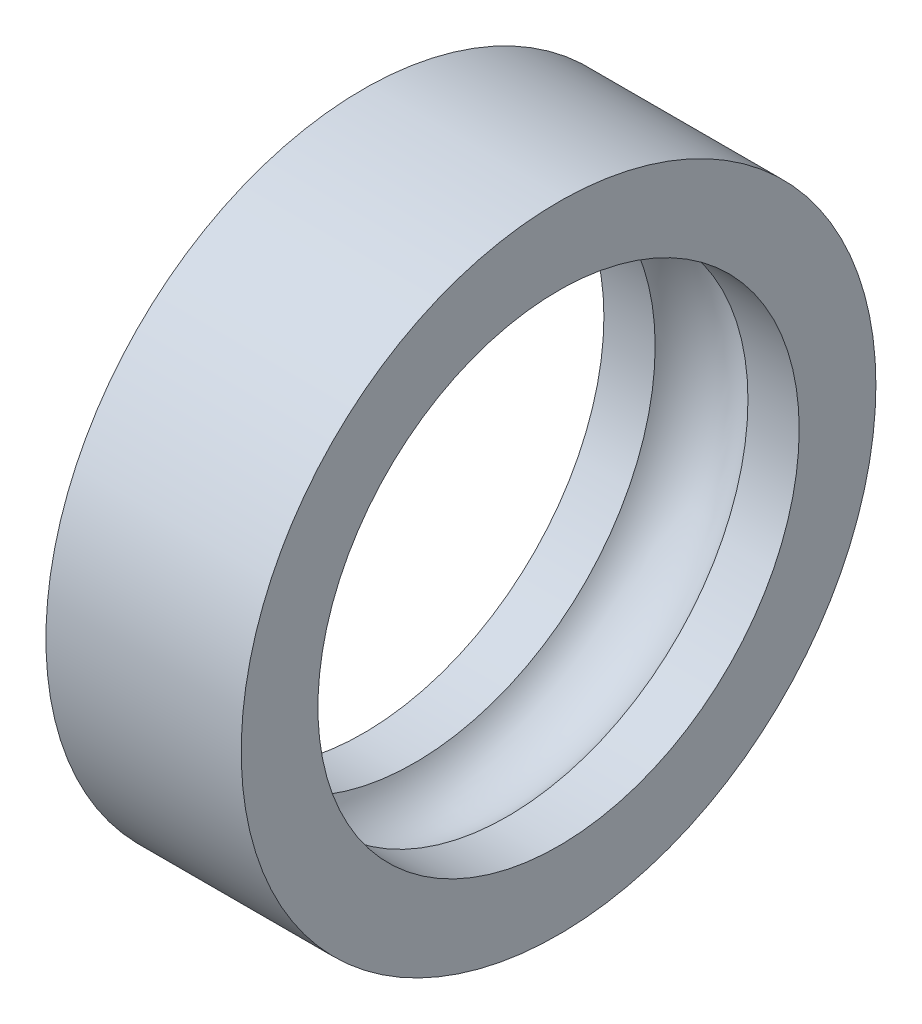
ISO-10303-21;
HEADER;
FILE_DESCRIPTION(('STEP AP214'),'2;1');
FILE_NAME('part.step','',(''),(''),'','','');
FILE_SCHEMA(('AUTOMOTIVE_DESIGN { 1 0 10303 214 1 1 1 1 }'));
ENDSEC;
DATA;
#1=APPLICATION_CONTEXT('core data for automotive mechanical design processes');
#2=APPLICATION_PROTOCOL_DEFINITION('international standard','automotive_design',2000,#1);
#3=PRODUCT_CONTEXT('',#1,'mechanical');
#4=PRODUCT('Part','Part','',(#3));
#5=PRODUCT_RELATED_PRODUCT_CATEGORY('part','',(#4));
#6=PRODUCT_DEFINITION_FORMATION('','',#4);
#7=PRODUCT_DEFINITION_CONTEXT('part definition',#1,'design');
#8=PRODUCT_DEFINITION('design','',#6,#7);
#9=PRODUCT_DEFINITION_SHAPE('','',#8);
#10=(LENGTH_UNIT() NAMED_UNIT(*) SI_UNIT(.MILLI.,.METRE.));
#11=(NAMED_UNIT(*) PLANE_ANGLE_UNIT() SI_UNIT($,.RADIAN.));
#12=(NAMED_UNIT(*) SI_UNIT($,.STERADIAN.) SOLID_ANGLE_UNIT());
#13=UNCERTAINTY_MEASURE_WITH_UNIT(LENGTH_MEASURE(1.E-05),#10,'distance_accuracy_value','');
#14=(GEOMETRIC_REPRESENTATION_CONTEXT(3) GLOBAL_UNCERTAINTY_ASSIGNED_CONTEXT((#13)) GLOBAL_UNIT_ASSIGNED_CONTEXT((#10,
#11,#12)) REPRESENTATION_CONTEXT('',''));
#15=CARTESIAN_POINT('',(0.,0.,0.));
#16=DIRECTION('',(0.,0.,1.));
#17=DIRECTION('',(1.,0.,0.));
#18=AXIS2_PLACEMENT_3D('',#15,#16,#17);
#19=CARTESIAN_POINT('',(-79.7731733916,250.5128135227,0.));
#20=DIRECTION('',(-1.,0.,0.));
#21=DIRECTION('',(0.,0.,1.));
#22=AXIS2_PLACEMENT_3D('',#19,#20,#21);
#23=PLANE('',#22);
#24=CARTESIAN_POINT('',(-79.7731733916,-8.75,0.));
#25=DIRECTION('',(1.,0.,0.));
#26=DIRECTION('',(0.,0.,-1.));
#27=AXIS2_PLACEMENT_3D('',#24,#25,#26);
#28=CIRCLE('',#27,196.600985823598);
#29=CARTESIAN_POINT('',(-79.7731733916,-8.75,-196.600985823598));
#30=VERTEX_POINT('',#29);
#31=EDGE_CURVE('E44',#30,#30,#28,.T.);
#32=ORIENTED_EDGE('',*,*,#31,.T.);
#33=EDGE_LOOP('',(#32));
#34=FACE_BOUND('',#33,.T.);
#35=CARTESIAN_POINT('',(-79.7731733916,-8.75,0.));
#36=DIRECTION('',(1.,0.,0.));
#37=DIRECTION('',(0.,0.,-1.));
#38=AXIS2_PLACEMENT_3D('',#35,#36,#37);
#39=CIRCLE('',#38,259.2628135227);
#40=CARTESIAN_POINT('',(-79.7731733916,-8.75,-259.2628135227));
#41=VERTEX_POINT('',#40);
#42=EDGE_CURVE('E10',#41,#41,#39,.T.);
#43=ORIENTED_EDGE('',*,*,#42,.F.);
#44=EDGE_LOOP('',(#43));
#45=FACE_BOUND('',#44,.T.);
#46=ADVANCED_FACE('F37',(#34,#45),#23,.T.);
#47=CARTESIAN_POINT('',(79.7731733916001,-8.75,0.));
#48=DIRECTION('',(1.,0.,0.));
#49=DIRECTION('',(0.,0.,-1.));
#50=AXIS2_PLACEMENT_3D('',#47,#48,#49);
#51=CYLINDRICAL_SURFACE('',#50,196.600985823598);
#52=CARTESIAN_POINT('',(-37.90451525551,-8.75,0.));
#53=DIRECTION('',(1.,0.,0.));
#54=DIRECTION('',(0.,0.,-1.));
#55=AXIS2_PLACEMENT_3D('',#52,#53,#54);
#56=CIRCLE('',#55,196.600985823598);
#57=CARTESIAN_POINT('',(-37.90451525551,-8.75,-196.600985823598));
#58=VERTEX_POINT('',#57);
#59=EDGE_CURVE('E49',#58,#58,#56,.T.);
#60=ORIENTED_EDGE('',*,*,#59,.T.);
#61=EDGE_LOOP('',(#60));
#62=FACE_BOUND('',#61,.T.);
#63=ORIENTED_EDGE('',*,*,#31,.F.);
#64=EDGE_LOOP('',(#63));
#65=FACE_BOUND('',#64,.T.);
#66=ADVANCED_FACE('F81',(#62,#65),#51,.F.);
#67=CARTESIAN_POINT('',(0.,-8.75,0.));
#68=DIRECTION('',(1.,0.,0.));
#69=DIRECTION('',(0.,0.,-1.));
#70=AXIS2_PLACEMENT_3D('',#67,#68,#69);
#71=TOROIDAL_SURFACE('',#70,174.503816794125,43.87524536538);
#72=CARTESIAN_POINT('',(37.90451525551,-8.75,0.));
#73=DIRECTION('',(1.,0.,0.));
#74=DIRECTION('',(0.,0.,-1.));
#75=AXIS2_PLACEMENT_3D('',#72,#73,#74);
#76=CIRCLE('',#75,196.600985823598);
#77=CARTESIAN_POINT('',(37.90451525551,-8.75,-196.600985823598));
#78=VERTEX_POINT('',#77);
#79=EDGE_CURVE('E54',#78,#78,#76,.T.);
#80=ORIENTED_EDGE('',*,*,#79,.T.);
#81=EDGE_LOOP('',(#80));
#82=FACE_BOUND('',#81,.T.);
#83=ORIENTED_EDGE('',*,*,#59,.F.);
#84=EDGE_LOOP('',(#83));
#85=FACE_BOUND('',#84,.T.);
#86=ADVANCED_FACE('F85',(#82,#85),#71,.F.);
#87=CARTESIAN_POINT('',(79.7731733916001,-8.75,0.));
#88=DIRECTION('',(1.,0.,0.));
#89=DIRECTION('',(0.,0.,-1.));
#90=AXIS2_PLACEMENT_3D('',#87,#88,#89);
#91=CYLINDRICAL_SURFACE('',#90,196.600985823598);
#92=CARTESIAN_POINT('',(79.7731733916,-8.75,0.));
#93=DIRECTION('',(1.,0.,0.));
#94=DIRECTION('',(0.,0.,-1.));
#95=AXIS2_PLACEMENT_3D('',#92,#93,#94);
#96=CIRCLE('',#95,196.600985823598);
#97=CARTESIAN_POINT('',(79.7731733916,-8.75,-196.600985823598));
#98=VERTEX_POINT('',#97);
#99=EDGE_CURVE('E60',#98,#98,#96,.T.);
#100=ORIENTED_EDGE('',*,*,#99,.T.);
#101=EDGE_LOOP('',(#100));
#102=FACE_BOUND('',#101,.T.);
#103=ORIENTED_EDGE('',*,*,#79,.F.);
#104=EDGE_LOOP('',(#103));
#105=FACE_BOUND('',#104,.T.);
#106=ADVANCED_FACE('F78',(#102,#105),#91,.F.);
#107=CARTESIAN_POINT('',(79.7731733916,250.5128135227,0.));
#108=DIRECTION('',(1.,0.,0.));
#109=DIRECTION('',(0.,0.,-1.));
#110=AXIS2_PLACEMENT_3D('',#107,#108,#109);
#111=PLANE('',#110);
#112=CARTESIAN_POINT('',(79.7731733916,-8.75,0.));
#113=DIRECTION('',(1.,0.,0.));
#114=DIRECTION('',(0.,0.,-1.));
#115=AXIS2_PLACEMENT_3D('',#112,#113,#114);
#116=CIRCLE('',#115,259.2628135227);
#117=CARTESIAN_POINT('',(79.7731733916,-8.75,-259.2628135227));
#118=VERTEX_POINT('',#117);
#119=EDGE_CURVE('E64',#118,#118,#116,.T.);
#120=ORIENTED_EDGE('',*,*,#119,.T.);
#121=EDGE_LOOP('',(#120));
#122=FACE_BOUND('',#121,.T.);
#123=ORIENTED_EDGE('',*,*,#99,.F.);
#124=EDGE_LOOP('',(#123));
#125=FACE_BOUND('',#124,.T.);
#126=ADVANCED_FACE('F69',(#122,#125),#111,.T.);
#127=CARTESIAN_POINT('',(79.7731733916001,-8.75,0.));
#128=DIRECTION('',(1.,0.,0.));
#129=DIRECTION('',(0.,0.,-1.));
#130=AXIS2_PLACEMENT_3D('',#127,#128,#129);
#131=CYLINDRICAL_SURFACE('',#130,259.2628135227);
#132=ORIENTED_EDGE('',*,*,#42,.T.);
#133=EDGE_LOOP('',(#132));
#134=FACE_BOUND('',#133,.T.);
#135=ORIENTED_EDGE('',*,*,#119,.F.);
#136=EDGE_LOOP('',(#135));
#137=FACE_BOUND('',#136,.T.);
#138=ADVANCED_FACE('F72',(#134,#137),#131,.T.);
#139=CLOSED_SHELL('',(#46,#66,#86,#106,#126,#138));
#140=MANIFOLD_SOLID_BREP('B2',#139);
#141=ADVANCED_BREP_SHAPE_REPRESENTATION('',(#18,#140),#14);
#142=SHAPE_DEFINITION_REPRESENTATION(#9,#141);
ENDSEC;
END-ISO-10303-21;
